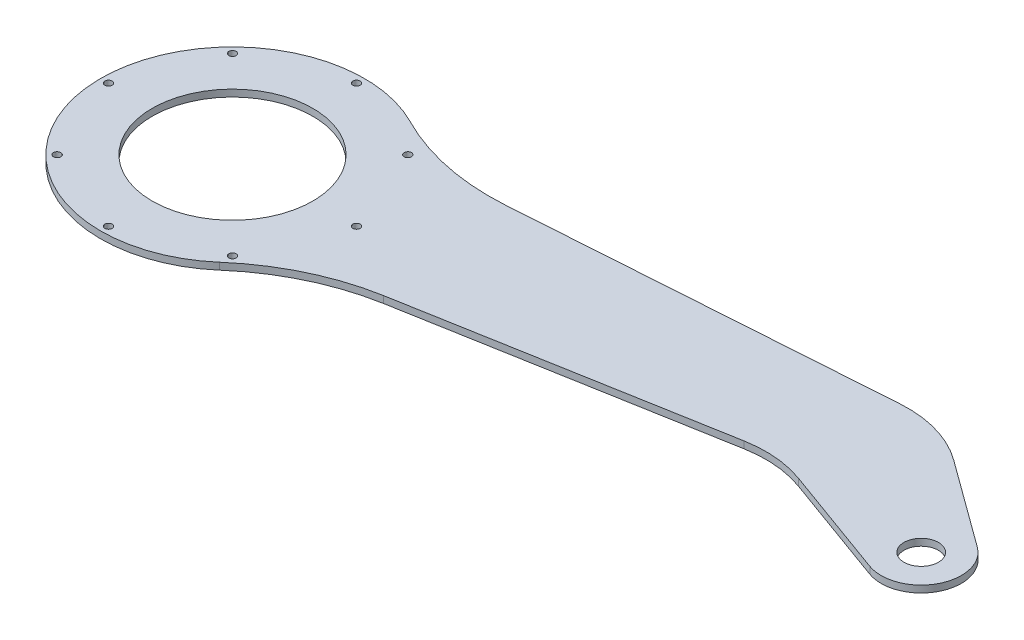
ISO-10303-21;
HEADER;
FILE_DESCRIPTION(('STEP AP214'),'2;1');
FILE_NAME('part.step','',(''),(''),'','','');
FILE_SCHEMA(('AUTOMOTIVE_DESIGN { 1 0 10303 214 1 1 1 1 }'));
ENDSEC;
DATA;
#1=APPLICATION_CONTEXT('core data for automotive mechanical design processes');
#2=APPLICATION_PROTOCOL_DEFINITION('international standard','automotive_design',2000,#1);
#3=PRODUCT_CONTEXT('',#1,'mechanical');
#4=PRODUCT('Part','Part','',(#3));
#5=PRODUCT_RELATED_PRODUCT_CATEGORY('part','',(#4));
#6=PRODUCT_DEFINITION_FORMATION('','',#4);
#7=PRODUCT_DEFINITION_CONTEXT('part definition',#1,'design');
#8=PRODUCT_DEFINITION('design','',#6,#7);
#9=PRODUCT_DEFINITION_SHAPE('','',#8);
#10=(LENGTH_UNIT() NAMED_UNIT(*) SI_UNIT(.MILLI.,.METRE.));
#11=(NAMED_UNIT(*) PLANE_ANGLE_UNIT() SI_UNIT($,.RADIAN.));
#12=(NAMED_UNIT(*) SI_UNIT($,.STERADIAN.) SOLID_ANGLE_UNIT());
#13=UNCERTAINTY_MEASURE_WITH_UNIT(LENGTH_MEASURE(1.E-05),#10,'distance_accuracy_value','');
#14=(GEOMETRIC_REPRESENTATION_CONTEXT(3) GLOBAL_UNCERTAINTY_ASSIGNED_CONTEXT((#13)) GLOBAL_UNIT_ASSIGNED_CONTEXT((#10,
#11,#12)) REPRESENTATION_CONTEXT('',''));
#15=CARTESIAN_POINT('',(0.,0.,0.));
#16=DIRECTION('',(0.,0.,1.));
#17=DIRECTION('',(1.,0.,0.));
#18=AXIS2_PLACEMENT_3D('',#15,#16,#17);
#19=CARTESIAN_POINT('',(28.8662620660002,3.,-79.6494584805988));
#20=DIRECTION('',(-0.340729771025605,0.,0.940161275067655));
#21=DIRECTION('',(0.940161275067655,0.,0.340729771025605));
#22=AXIS2_PLACEMENT_3D('',#19,#20,#21);
#23=PLANE('',#22);
#24=DIRECTION('',(-0.940161275067655,0.,-0.340729771025605));
#25=VECTOR('',#24,1.);
#26=CARTESIAN_POINT('',(28.8662620660002,3.,-79.6494584805988));
#27=LINE('',#26,#25);
#28=CARTESIAN_POINT('',(294.037229007052,3.,16.4528223136839));
#29=VERTEX_POINT('',#28);
#30=CARTESIAN_POINT('',(245.23023292495,3.,-1.23562863671853));
#31=VERTEX_POINT('',#30);
#32=EDGE_CURVE('E114',#29,#31,#27,.T.);
#33=ORIENTED_EDGE('',*,*,#32,.T.);
#34=DIRECTION('',(0.,-1.,0.));
#35=VECTOR('',#34,1.);
#36=CARTESIAN_POINT('',(245.23023292495,0.,-1.23562863671853));
#37=LINE('',#36,#35);
#38=CARTESIAN_POINT('',(245.23023292495,0.,-1.23562863671853));
#39=VERTEX_POINT('',#38);
#40=EDGE_CURVE('E232',#31,#39,#37,.T.);
#41=ORIENTED_EDGE('',*,*,#40,.T.);
#42=DIRECTION('',(-0.940161275067655,0.,-0.340729771025605));
#43=VECTOR('',#42,1.);
#44=CARTESIAN_POINT('',(28.8662620660002,0.,-79.6494584805988));
#45=LINE('',#44,#43);
#46=CARTESIAN_POINT('',(294.037229007052,0.,16.4528223136839));
#47=VERTEX_POINT('',#46);
#48=EDGE_CURVE('E117',#47,#39,#45,.T.);
#49=ORIENTED_EDGE('',*,*,#48,.F.);
#50=DIRECTION('',(0.,-1.,0.));
#51=VECTOR('',#50,1.);
#52=CARTESIAN_POINT('',(294.037229007052,3.,16.4528223136839));
#53=LINE('',#52,#51);
#54=EDGE_CURVE('E110',#29,#47,#53,.T.);
#55=ORIENTED_EDGE('',*,*,#54,.F.);
#56=EDGE_LOOP('',(#33,#41,#49,#55));
#57=FACE_BOUND('',#56,.T.);
#58=ADVANCED_FACE('F35',(#57),#23,.T.);
#59=CARTESIAN_POINT('',(300.,3.,0.));
#60=DIRECTION('',(0.,-1.,0.));
#61=DIRECTION('',(0.,0.,-1.));
#62=AXIS2_PLACEMENT_3D('',#59,#60,#61);
#63=CYLINDRICAL_SURFACE('',#62,17.5);
#64=CARTESIAN_POINT('',(300.,0.,0.));
#65=DIRECTION('',(0.,1.,0.));
#66=DIRECTION('',(0.,0.,1.));
#67=AXIS2_PLACEMENT_3D('',#64,#65,#66);
#68=CIRCLE('',#67,17.5);
#69=CARTESIAN_POINT('',(310.311776158135,0.,-14.1392104611441));
#70=VERTEX_POINT('',#69);
#71=EDGE_CURVE('E183',#47,#70,#68,.T.);
#72=ORIENTED_EDGE('',*,*,#71,.T.);
#73=DIRECTION('',(0.,-1.,0.));
#74=VECTOR('',#73,1.);
#75=CARTESIAN_POINT('',(310.311776158135,3.,-14.1392104611441));
#76=LINE('',#75,#74);
#77=CARTESIAN_POINT('',(310.311776158135,3.,-14.1392104611441));
#78=VERTEX_POINT('',#77);
#79=EDGE_CURVE('E121',#78,#70,#76,.T.);
#80=ORIENTED_EDGE('',*,*,#79,.F.);
#81=CARTESIAN_POINT('',(300.,3.,0.));
#82=DIRECTION('',(0.,1.,0.));
#83=DIRECTION('',(0.,0.,1.));
#84=AXIS2_PLACEMENT_3D('',#81,#82,#83);
#85=CIRCLE('',#84,17.5);
#86=EDGE_CURVE('E124',#29,#78,#85,.T.);
#87=ORIENTED_EDGE('',*,*,#86,.F.);
#88=ORIENTED_EDGE('',*,*,#54,.T.);
#89=EDGE_LOOP('',(#72,#80,#87,#88));
#90=FACE_BOUND('',#89,.T.);
#91=ADVANCED_FACE('F125',(#90),#63,.T.);
#92=CARTESIAN_POINT('',(114.474448029618,3.,-156.964065966195));
#93=DIRECTION('',(-0.589244351893404,0.,0.80795488349395));
#94=DIRECTION('',(0.80795488349395,0.,0.589244351893404));
#95=AXIS2_PLACEMENT_3D('',#92,#93,#94);
#96=PLANE('',#95);
#97=DIRECTION('',(-0.80795488349395,0.,-0.589244351893404));
#98=VECTOR('',#97,1.);
#99=CARTESIAN_POINT('',(114.474448029618,0.,-156.964065966195));
#100=LINE('',#99,#98);
#101=CARTESIAN_POINT('',(272.247100749326,0.,-41.8999127596458));
#102=VERTEX_POINT('',#101);
#103=EDGE_CURVE('E185',#70,#102,#100,.T.);
#104=ORIENTED_EDGE('',*,*,#103,.T.);
#105=DIRECTION('',(0.,-1.,0.));
#106=VECTOR('',#105,1.);
#107=CARTESIAN_POINT('',(272.247100749326,3.,-41.8999127596458));
#108=LINE('',#107,#106);
#109=CARTESIAN_POINT('',(272.247100749326,3.,-41.8999127596458));
#110=VERTEX_POINT('',#109);
#111=EDGE_CURVE('E227',#102,#110,#108,.F.);
#112=ORIENTED_EDGE('',*,*,#111,.T.);
#113=DIRECTION('',(-0.80795488349395,0.,-0.589244351893404));
#114=VECTOR('',#113,1.);
#115=CARTESIAN_POINT('',(114.474448029618,3.,-156.964065966195));
#116=LINE('',#115,#114);
#117=EDGE_CURVE('E130',#78,#110,#116,.T.);
#118=ORIENTED_EDGE('',*,*,#117,.F.);
#119=ORIENTED_EDGE('',*,*,#79,.T.);
#120=EDGE_LOOP('',(#104,#112,#118,#119));
#121=FACE_BOUND('',#120,.T.);
#122=ADVANCED_FACE('F277',(#121),#96,.F.);
#123=CARTESIAN_POINT('',(-2.37846094109579,3.,-34.9190911043183));
#124=DIRECTION('',(-0.0679560268884512,0.,-0.997688317266237));
#125=DIRECTION('',(-0.997688317266237,0.,0.0679560268884512));
#126=AXIS2_PLACEMENT_3D('',#123,#124,#125);
#127=PLANE('',#126);
#128=DIRECTION('',(0.997688317266237,0.,-0.0679560268884512));
#129=VECTOR('',#128,1.);
#130=CARTESIAN_POINT('',(-2.37846094109579,0.,-34.9190911043183));
#131=LINE('',#130,#129);
#132=CARTESIAN_POINT('',(78.5589077176873,0.,-40.4320172413385));
#133=VERTEX_POINT('',#132);
#134=CARTESIAN_POINT('',(239.387081810233,0.,-51.3865844482602));
#135=VERTEX_POINT('',#134);
#136=EDGE_CURVE('E188',#133,#135,#131,.T.);
#137=ORIENTED_EDGE('',*,*,#136,.F.);
#138=DIRECTION('',(0.,-1.,0.));
#139=VECTOR('',#138,1.);
#140=CARTESIAN_POINT('',(78.5589077176873,3.,-40.4320172413385));
#141=LINE('',#140,#139);
#142=CARTESIAN_POINT('',(78.5589077176873,3.,-40.4320172413385));
#143=VERTEX_POINT('',#142);
#144=EDGE_CURVE('E56',#133,#143,#141,.F.);
#145=ORIENTED_EDGE('',*,*,#144,.T.);
#146=DIRECTION('',(0.997688317266237,0.,-0.0679560268884512));
#147=VECTOR('',#146,1.);
#148=CARTESIAN_POINT('',(-2.37846094109579,3.,-34.9190911043183));
#149=LINE('',#148,#147);
#150=CARTESIAN_POINT('',(239.387081810233,3.,-51.3865844482602));
#151=VERTEX_POINT('',#150);
#152=EDGE_CURVE('E144',#143,#151,#149,.T.);
#153=ORIENTED_EDGE('',*,*,#152,.T.);
#154=DIRECTION('',(0.,-1.,0.));
#155=VECTOR('',#154,1.);
#156=CARTESIAN_POINT('',(239.387081810233,0.,-51.3865844482602));
#157=LINE('',#156,#155);
#158=EDGE_CURVE('E120',#151,#135,#157,.T.);
#159=ORIENTED_EDGE('',*,*,#158,.T.);
#160=EDGE_LOOP('',(#137,#145,#153,#159));
#161=FACE_BOUND('',#160,.T.);
#162=ADVANCED_FACE('F270',(#161),#127,.T.);
#163=CARTESIAN_POINT('',(0.,3.,0.));
#164=DIRECTION('',(0.,-1.,0.));
#165=DIRECTION('',(0.,0.,-1.));
#166=AXIS2_PLACEMENT_3D('',#163,#164,#165);
#167=CYLINDRICAL_SURFACE('',#166,57.5);
#168=CARTESIAN_POINT('',(0.,0.,0.));
#169=DIRECTION('',(0.,1.,0.));
#170=DIRECTION('',(0.,0.,1.));
#171=AXIS2_PLACEMENT_3D('',#168,#169,#170);
#172=CIRCLE('',#171,57.5);
#173=CARTESIAN_POINT('',(26.1993018359265,0.,-51.1844369248116));
#174=VERTEX_POINT('',#173);
#175=CARTESIAN_POINT('',(37.7849911882178,0.,43.3421785436116));
#176=VERTEX_POINT('',#175);
#177=EDGE_CURVE('E190',#174,#176,#172,.T.);
#178=ORIENTED_EDGE('',*,*,#177,.T.);
#179=DIRECTION('',(0.,-1.,0.));
#180=VECTOR('',#179,1.);
#181=CARTESIAN_POINT('',(37.7849911882178,3.,43.3421785436116));
#182=LINE('',#181,#180);
#183=CARTESIAN_POINT('',(37.7849911882178,3.,43.3421785436116));
#184=VERTEX_POINT('',#183);
#185=EDGE_CURVE('E245',#176,#184,#182,.F.);
#186=ORIENTED_EDGE('',*,*,#185,.T.);
#187=CARTESIAN_POINT('',(0.,3.,0.));
#188=DIRECTION('',(0.,1.,0.));
#189=DIRECTION('',(0.,0.,1.));
#190=AXIS2_PLACEMENT_3D('',#187,#188,#189);
#191=CIRCLE('',#190,57.5);
#192=CARTESIAN_POINT('',(26.1993018359265,3.,-51.1844369248116));
#193=VERTEX_POINT('',#192);
#194=EDGE_CURVE('E146',#193,#184,#191,.T.);
#195=ORIENTED_EDGE('',*,*,#194,.F.);
#196=DIRECTION('',(0.,-1.,0.));
#197=VECTOR('',#196,1.);
#198=CARTESIAN_POINT('',(26.1993018359265,3.,-51.1844369248116));
#199=LINE('',#198,#197);
#200=EDGE_CURVE('E242',#193,#174,#199,.T.);
#201=ORIENTED_EDGE('',*,*,#200,.T.);
#202=EDGE_LOOP('',(#178,#186,#195,#201));
#203=FACE_BOUND('',#202,.T.);
#204=ADVANCED_FACE('F264',(#203),#167,.T.);
#205=CARTESIAN_POINT('',(54.,3.,1.88539992297529E-13));
#206=DIRECTION('',(0.,-1.,0.));
#207=DIRECTION('',(0.,0.,-1.));
#208=AXIS2_PLACEMENT_3D('',#205,#206,#207);
#209=CYLINDRICAL_SURFACE('',#208,1.6);
#210=CARTESIAN_POINT('',(54.,3.,1.88539992297529E-13));
#211=DIRECTION('',(0.,1.,0.));
#212=DIRECTION('',(0.,0.,1.));
#213=AXIS2_PLACEMENT_3D('',#210,#211,#212);
#214=CIRCLE('',#213,1.6);
#215=CARTESIAN_POINT('',(54.,3.,1.60000000000019));
#216=VERTEX_POINT('',#215);
#217=EDGE_CURVE('E176',#216,#216,#214,.T.);
#218=ORIENTED_EDGE('',*,*,#217,.T.);
#219=EDGE_LOOP('',(#218));
#220=FACE_BOUND('',#219,.T.);
#221=CARTESIAN_POINT('',(54.,0.,1.88539992297529E-13));
#222=DIRECTION('',(0.,1.,0.));
#223=DIRECTION('',(0.,0.,1.));
#224=AXIS2_PLACEMENT_3D('',#221,#222,#223);
#225=CIRCLE('',#224,1.6);
#226=CARTESIAN_POINT('',(54.,0.,1.60000000000019));
#227=VERTEX_POINT('',#226);
#228=EDGE_CURVE('E140',#227,#227,#225,.T.);
#229=ORIENTED_EDGE('',*,*,#228,.F.);
#230=EDGE_LOOP('',(#229));
#231=FACE_BOUND('',#230,.T.);
#232=ADVANCED_FACE('F350',(#220,#231),#209,.F.);
#233=CARTESIAN_POINT('',(0.,3.,-54.));
#234=DIRECTION('',(0.,-1.,0.));
#235=DIRECTION('',(0.,0.,-1.));
#236=AXIS2_PLACEMENT_3D('',#233,#234,#235);
#237=CYLINDRICAL_SURFACE('',#236,1.6);
#238=CARTESIAN_POINT('',(0.,3.,-54.));
#239=DIRECTION('',(0.,1.,0.));
#240=DIRECTION('',(0.,0.,1.));
#241=AXIS2_PLACEMENT_3D('',#238,#239,#240);
#242=CIRCLE('',#241,1.6);
#243=CARTESIAN_POINT('',(0.,3.,-52.4));
#244=VERTEX_POINT('',#243);
#245=EDGE_CURVE('E173',#244,#244,#242,.T.);
#246=ORIENTED_EDGE('',*,*,#245,.T.);
#247=EDGE_LOOP('',(#246));
#248=FACE_BOUND('',#247,.T.);
#249=CARTESIAN_POINT('',(0.,0.,-54.));
#250=DIRECTION('',(0.,1.,0.));
#251=DIRECTION('',(0.,0.,1.));
#252=AXIS2_PLACEMENT_3D('',#249,#250,#251);
#253=CIRCLE('',#252,1.6);
#254=CARTESIAN_POINT('',(0.,0.,-52.4));
#255=VERTEX_POINT('',#254);
#256=EDGE_CURVE('E217',#255,#255,#253,.T.);
#257=ORIENTED_EDGE('',*,*,#256,.F.);
#258=EDGE_LOOP('',(#257));
#259=FACE_BOUND('',#258,.T.);
#260=ADVANCED_FACE('F452',(#248,#259),#237,.F.);
#261=CARTESIAN_POINT('',(38.1837661840736,3.,-38.1837661840735));
#262=DIRECTION('',(0.,-1.,0.));
#263=DIRECTION('',(0.,0.,-1.));
#264=AXIS2_PLACEMENT_3D('',#261,#262,#263);
#265=CYLINDRICAL_SURFACE('',#264,1.6);
#266=CARTESIAN_POINT('',(38.1837661840736,3.,-38.1837661840735));
#267=DIRECTION('',(0.,1.,0.));
#268=DIRECTION('',(0.,0.,1.));
#269=AXIS2_PLACEMENT_3D('',#266,#267,#268);
#270=CIRCLE('',#269,1.6);
#271=CARTESIAN_POINT('',(38.1837661840736,3.,-36.5837661840735));
#272=VERTEX_POINT('',#271);
#273=EDGE_CURVE('E170',#272,#272,#270,.T.);
#274=ORIENTED_EDGE('',*,*,#273,.T.);
#275=EDGE_LOOP('',(#274));
#276=FACE_BOUND('',#275,.T.);
#277=CARTESIAN_POINT('',(38.1837661840736,0.,-38.1837661840735));
#278=DIRECTION('',(0.,1.,0.));
#279=DIRECTION('',(0.,0.,1.));
#280=AXIS2_PLACEMENT_3D('',#277,#278,#279);
#281=CIRCLE('',#280,1.6);
#282=CARTESIAN_POINT('',(38.1837661840736,0.,-36.5837661840735));
#283=VERTEX_POINT('',#282);
#284=EDGE_CURVE('E214',#283,#283,#281,.T.);
#285=ORIENTED_EDGE('',*,*,#284,.F.);
#286=EDGE_LOOP('',(#285));
#287=FACE_BOUND('',#286,.T.);
#288=ADVANCED_FACE('F442',(#276,#287),#265,.F.);
#289=CARTESIAN_POINT('',(38.1837661840734,3.,38.1837661840738));
#290=DIRECTION('',(0.,-1.,0.));
#291=DIRECTION('',(0.,0.,-1.));
#292=AXIS2_PLACEMENT_3D('',#289,#290,#291);
#293=CYLINDRICAL_SURFACE('',#292,1.6);
#294=CARTESIAN_POINT('',(38.1837661840734,3.,38.1837661840738));
#295=DIRECTION('',(0.,1.,0.));
#296=DIRECTION('',(0.,0.,1.));
#297=AXIS2_PLACEMENT_3D('',#294,#295,#296);
#298=CIRCLE('',#297,1.6);
#299=CARTESIAN_POINT('',(38.1837661840734,3.,39.7837661840738));
#300=VERTEX_POINT('',#299);
#301=EDGE_CURVE('E167',#300,#300,#298,.T.);
#302=ORIENTED_EDGE('',*,*,#301,.T.);
#303=EDGE_LOOP('',(#302));
#304=FACE_BOUND('',#303,.T.);
#305=CARTESIAN_POINT('',(38.1837661840734,0.,38.1837661840738));
#306=DIRECTION('',(0.,1.,0.));
#307=DIRECTION('',(0.,0.,1.));
#308=AXIS2_PLACEMENT_3D('',#305,#306,#307);
#309=CIRCLE('',#308,1.6);
#310=CARTESIAN_POINT('',(38.1837661840734,0.,39.7837661840738));
#311=VERTEX_POINT('',#310);
#312=EDGE_CURVE('E211',#311,#311,#309,.T.);
#313=ORIENTED_EDGE('',*,*,#312,.F.);
#314=EDGE_LOOP('',(#313));
#315=FACE_BOUND('',#314,.T.);
#316=ADVANCED_FACE('F432',(#304,#315),#293,.F.);
#317=CARTESIAN_POINT('',(-3.77079984595058E-13,3.,54.));
#318=DIRECTION('',(0.,-1.,0.));
#319=DIRECTION('',(0.,0.,-1.));
#320=AXIS2_PLACEMENT_3D('',#317,#318,#319);
#321=CYLINDRICAL_SURFACE('',#320,1.6);
#322=CARTESIAN_POINT('',(-3.77079984595058E-13,3.,54.));
#323=DIRECTION('',(0.,1.,0.));
#324=DIRECTION('',(0.,0.,1.));
#325=AXIS2_PLACEMENT_3D('',#322,#323,#324);
#326=CIRCLE('',#325,1.6);
#327=CARTESIAN_POINT('',(-3.77079984595058E-13,3.,55.6));
#328=VERTEX_POINT('',#327);
#329=EDGE_CURVE('E164',#328,#328,#326,.T.);
#330=ORIENTED_EDGE('',*,*,#329,.T.);
#331=EDGE_LOOP('',(#330));
#332=FACE_BOUND('',#331,.T.);
#333=CARTESIAN_POINT('',(-3.77079984595058E-13,0.,54.));
#334=DIRECTION('',(0.,1.,0.));
#335=DIRECTION('',(0.,0.,1.));
#336=AXIS2_PLACEMENT_3D('',#333,#334,#335);
#337=CIRCLE('',#336,1.6);
#338=CARTESIAN_POINT('',(-3.77079984595058E-13,0.,55.6));
#339=VERTEX_POINT('',#338);
#340=EDGE_CURVE('E208',#339,#339,#337,.T.);
#341=ORIENTED_EDGE('',*,*,#340,.F.);
#342=EDGE_LOOP('',(#341));
#343=FACE_BOUND('',#342,.T.);
#344=ADVANCED_FACE('F422',(#332,#343),#321,.F.);
#345=CARTESIAN_POINT('',(-38.1837661840739,3.,38.1837661840732));
#346=DIRECTION('',(0.,-1.,0.));
#347=DIRECTION('',(0.,0.,-1.));
#348=AXIS2_PLACEMENT_3D('',#345,#346,#347);
#349=CYLINDRICAL_SURFACE('',#348,1.6);
#350=CARTESIAN_POINT('',(-38.1837661840739,3.,38.1837661840732));
#351=DIRECTION('',(0.,1.,0.));
#352=DIRECTION('',(0.,0.,1.));
#353=AXIS2_PLACEMENT_3D('',#350,#351,#352);
#354=CIRCLE('',#353,1.6);
#355=CARTESIAN_POINT('',(-38.1837661840739,3.,39.7837661840732));
#356=VERTEX_POINT('',#355);
#357=EDGE_CURVE('E161',#356,#356,#354,.T.);
#358=ORIENTED_EDGE('',*,*,#357,.T.);
#359=EDGE_LOOP('',(#358));
#360=FACE_BOUND('',#359,.T.);
#361=CARTESIAN_POINT('',(-38.1837661840739,0.,38.1837661840732));
#362=DIRECTION('',(0.,1.,0.));
#363=DIRECTION('',(0.,0.,1.));
#364=AXIS2_PLACEMENT_3D('',#361,#362,#363);
#365=CIRCLE('',#364,1.6);
#366=CARTESIAN_POINT('',(-38.1837661840739,0.,39.7837661840732));
#367=VERTEX_POINT('',#366);
#368=EDGE_CURVE('E205',#367,#367,#365,.T.);
#369=ORIENTED_EDGE('',*,*,#368,.F.);
#370=EDGE_LOOP('',(#369));
#371=FACE_BOUND('',#370,.T.);
#372=ADVANCED_FACE('F412',(#360,#371),#349,.F.);
#373=CARTESIAN_POINT('',(-54.,3.,-5.65619976892588E-13));
#374=DIRECTION('',(0.,-1.,0.));
#375=DIRECTION('',(0.,0.,-1.));
#376=AXIS2_PLACEMENT_3D('',#373,#374,#375);
#377=CYLINDRICAL_SURFACE('',#376,1.6);
#378=CARTESIAN_POINT('',(-54.,3.,-5.65619976892588E-13));
#379=DIRECTION('',(0.,1.,0.));
#380=DIRECTION('',(0.,0.,1.));
#381=AXIS2_PLACEMENT_3D('',#378,#379,#380);
#382=CIRCLE('',#381,1.6);
#383=CARTESIAN_POINT('',(-54.,3.,1.59999999999943));
#384=VERTEX_POINT('',#383);
#385=EDGE_CURVE('E158',#384,#384,#382,.T.);
#386=ORIENTED_EDGE('',*,*,#385,.T.);
#387=EDGE_LOOP('',(#386));
#388=FACE_BOUND('',#387,.T.);
#389=CARTESIAN_POINT('',(-54.,0.,-5.65619976892588E-13));
#390=DIRECTION('',(0.,1.,0.));
#391=DIRECTION('',(0.,0.,1.));
#392=AXIS2_PLACEMENT_3D('',#389,#390,#391);
#393=CIRCLE('',#392,1.6);
#394=CARTESIAN_POINT('',(-54.,0.,1.59999999999943));
#395=VERTEX_POINT('',#394);
#396=EDGE_CURVE('E202',#395,#395,#393,.T.);
#397=ORIENTED_EDGE('',*,*,#396,.F.);
#398=EDGE_LOOP('',(#397));
#399=FACE_BOUND('',#398,.T.);
#400=ADVANCED_FACE('F402',(#388,#399),#377,.F.);
#401=CARTESIAN_POINT('',(-38.1837661840731,3.,-38.183766184074));
#402=DIRECTION('',(0.,-1.,0.));
#403=DIRECTION('',(0.,0.,-1.));
#404=AXIS2_PLACEMENT_3D('',#401,#402,#403);
#405=CYLINDRICAL_SURFACE('',#404,1.6);
#406=CARTESIAN_POINT('',(-38.1837661840731,3.,-38.183766184074));
#407=DIRECTION('',(0.,1.,0.));
#408=DIRECTION('',(0.,0.,1.));
#409=AXIS2_PLACEMENT_3D('',#406,#407,#408);
#410=CIRCLE('',#409,1.6);
#411=CARTESIAN_POINT('',(-38.1837661840731,3.,-36.583766184074));
#412=VERTEX_POINT('',#411);
#413=EDGE_CURVE('E155',#412,#412,#410,.T.);
#414=ORIENTED_EDGE('',*,*,#413,.T.);
#415=EDGE_LOOP('',(#414));
#416=FACE_BOUND('',#415,.T.);
#417=CARTESIAN_POINT('',(-38.1837661840731,0.,-38.183766184074));
#418=DIRECTION('',(0.,1.,0.));
#419=DIRECTION('',(0.,0.,1.));
#420=AXIS2_PLACEMENT_3D('',#417,#418,#419);
#421=CIRCLE('',#420,1.6);
#422=CARTESIAN_POINT('',(-38.1837661840731,0.,-36.583766184074));
#423=VERTEX_POINT('',#422);
#424=EDGE_CURVE('E199',#423,#423,#421,.T.);
#425=ORIENTED_EDGE('',*,*,#424,.F.);
#426=EDGE_LOOP('',(#425));
#427=FACE_BOUND('',#426,.T.);
#428=ADVANCED_FACE('F392',(#416,#427),#405,.F.);
#429=CARTESIAN_POINT('',(0.,3.,0.));
#430=DIRECTION('',(0.,-1.,0.));
#431=DIRECTION('',(0.,0.,-1.));
#432=AXIS2_PLACEMENT_3D('',#429,#430,#431);
#433=CYLINDRICAL_SURFACE('',#432,35.);
#434=CARTESIAN_POINT('',(0.,3.,0.));
#435=DIRECTION('',(0.,1.,0.));
#436=DIRECTION('',(0.,0.,1.));
#437=AXIS2_PLACEMENT_3D('',#434,#435,#436);
#438=CIRCLE('',#437,35.);
#439=CARTESIAN_POINT('',(0.,3.,35.));
#440=VERTEX_POINT('',#439);
#441=EDGE_CURVE('E152',#440,#440,#438,.T.);
#442=ORIENTED_EDGE('',*,*,#441,.T.);
#443=EDGE_LOOP('',(#442));
#444=FACE_BOUND('',#443,.T.);
#445=CARTESIAN_POINT('',(0.,0.,0.));
#446=DIRECTION('',(0.,1.,0.));
#447=DIRECTION('',(0.,0.,1.));
#448=AXIS2_PLACEMENT_3D('',#445,#446,#447);
#449=CIRCLE('',#448,35.);
#450=CARTESIAN_POINT('',(0.,0.,35.));
#451=VERTEX_POINT('',#450);
#452=EDGE_CURVE('E196',#451,#451,#449,.T.);
#453=ORIENTED_EDGE('',*,*,#452,.F.);
#454=EDGE_LOOP('',(#453));
#455=FACE_BOUND('',#454,.T.);
#456=ADVANCED_FACE('F338',(#444,#455),#433,.F.);
#457=CARTESIAN_POINT('',(6.125,3.,34.4598951681516));
#458=DIRECTION('',(0.175,0.,0.984568433375761));
#459=DIRECTION('',(0.984568433375761,0.,-0.175));
#460=AXIS2_PLACEMENT_3D('',#457,#458,#459);
#461=PLANE('',#460);
#462=DIRECTION('',(-0.984568433375761,0.,0.175));
#463=VECTOR('',#462,1.);
#464=CARTESIAN_POINT('',(6.125,3.,34.4598951681516));
#465=LINE('',#464,#463);
#466=CARTESIAN_POINT('',(219.44374437367,3.,-3.45598655212382));
#467=VERTEX_POINT('',#466);
#468=CARTESIAN_POINT('',(85.99801934164,3.,20.2630370210122));
#469=VERTEX_POINT('',#468);
#470=EDGE_CURVE('E149',#467,#469,#465,.T.);
#471=ORIENTED_EDGE('',*,*,#470,.T.);
#472=DIRECTION('',(0.,-1.,0.));
#473=VECTOR('',#472,1.);
#474=CARTESIAN_POINT('',(85.99801934164,3.,20.2630370210122));
#475=LINE('',#474,#473);
#476=CARTESIAN_POINT('',(85.99801934164,0.,20.2630370210122));
#477=VERTEX_POINT('',#476);
#478=EDGE_CURVE('E239',#469,#477,#475,.T.);
#479=ORIENTED_EDGE('',*,*,#478,.T.);
#480=DIRECTION('',(-0.984568433375761,0.,0.175));
#481=VECTOR('',#480,1.);
#482=CARTESIAN_POINT('',(6.125,0.,34.4598951681516));
#483=LINE('',#482,#481);
#484=CARTESIAN_POINT('',(219.44374437367,0.,-3.45598655212382));
#485=VERTEX_POINT('',#484);
#486=EDGE_CURVE('E193',#485,#477,#483,.T.);
#487=ORIENTED_EDGE('',*,*,#486,.F.);
#488=DIRECTION('',(0.,-1.,0.));
#489=VECTOR('',#488,1.);
#490=CARTESIAN_POINT('',(219.44374437367,3.,-3.45598655212383));
#491=LINE('',#490,#489);
#492=EDGE_CURVE('E234',#485,#467,#491,.F.);
#493=ORIENTED_EDGE('',*,*,#492,.T.);
#494=EDGE_LOOP('',(#471,#479,#487,#493));
#495=FACE_BOUND('',#494,.T.);
#496=ADVANCED_FACE('F257',(#495),#461,.T.);
#497=CARTESIAN_POINT('',(300.,3.,0.));
#498=DIRECTION('',(0.,-1.,0.));
#499=DIRECTION('',(0.,0.,-1.));
#500=AXIS2_PLACEMENT_3D('',#497,#498,#499);
#501=CYLINDRICAL_SURFACE('',#500,7.50000000000001);
#502=CARTESIAN_POINT('',(300.,3.,0.));
#503=DIRECTION('',(0.,1.,0.));
#504=DIRECTION('',(0.,0.,1.));
#505=AXIS2_PLACEMENT_3D('',#502,#503,#504);
#506=CIRCLE('',#505,7.50000000000001);
#507=CARTESIAN_POINT('',(300.,3.,7.50000000000001));
#508=VERTEX_POINT('',#507);
#509=EDGE_CURVE('E179',#508,#508,#506,.T.);
#510=ORIENTED_EDGE('',*,*,#509,.T.);
#511=EDGE_LOOP('',(#510));
#512=FACE_BOUND('',#511,.T.);
#513=CARTESIAN_POINT('',(300.,0.,0.));
#514=DIRECTION('',(0.,1.,0.));
#515=DIRECTION('',(0.,0.,1.));
#516=AXIS2_PLACEMENT_3D('',#513,#514,#515);
#517=CIRCLE('',#516,7.50000000000001);
#518=CARTESIAN_POINT('',(300.,0.,7.50000000000001));
#519=VERTEX_POINT('',#518);
#520=EDGE_CURVE('E137',#519,#519,#517,.T.);
#521=ORIENTED_EDGE('',*,*,#520,.F.);
#522=EDGE_LOOP('',(#521));
#523=FACE_BOUND('',#522,.T.);
#524=ADVANCED_FACE('F326',(#512,#523),#501,.F.);
#525=CARTESIAN_POINT('',(0.,3.,0.));
#526=DIRECTION('',(0.,1.,0.));
#527=DIRECTION('',(0.,0.,1.));
#528=AXIS2_PLACEMENT_3D('',#525,#526,#527);
#529=PLANE('',#528);
#530=ORIENTED_EDGE('',*,*,#117,.T.);
#531=CARTESIAN_POINT('',(242.784883154656,3.,-1.50216858494831));
#532=DIRECTION('',(0.,1.,0.));
#533=DIRECTION('',(0.,0.,1.));
#534=AXIS2_PLACEMENT_3D('',#531,#532,#533);
#535=CIRCLE('',#534,50.);
#536=EDGE_CURVE('E229',#110,#151,#535,.T.);
#537=ORIENTED_EDGE('',*,*,#536,.T.);
#538=ORIENTED_EDGE('',*,*,#152,.F.);
#539=CARTESIAN_POINT('',(71.7633050288422,3.,-140.200848967962));
#540=DIRECTION('',(0.,1.,0.));
#541=DIRECTION('',(0.,0.,1.));
#542=AXIS2_PLACEMENT_3D('',#539,#540,#541);
#543=CIRCLE('',#542,100.);
#544=EDGE_CURVE('E11',#143,#193,#543,.F.);
#545=ORIENTED_EDGE('',*,*,#544,.T.);
#546=ORIENTED_EDGE('',*,*,#194,.T.);
#547=CARTESIAN_POINT('',(103.49801934164,3.,118.719880358588));
#548=DIRECTION('',(0.,1.,0.));
#549=DIRECTION('',(0.,0.,1.));
#550=AXIS2_PLACEMENT_3D('',#547,#548,#549);
#551=CIRCLE('',#550,100.);
#552=EDGE_CURVE('E250',#184,#469,#551,.F.);
#553=ORIENTED_EDGE('',*,*,#552,.T.);
#554=ORIENTED_EDGE('',*,*,#470,.F.);
#555=CARTESIAN_POINT('',(228.19374437367,3.,45.7724351166642));
#556=DIRECTION('',(0.,1.,0.));
#557=DIRECTION('',(0.,0.,1.));
#558=AXIS2_PLACEMENT_3D('',#555,#556,#557);
#559=CIRCLE('',#558,50.);
#560=EDGE_CURVE('E136',#467,#31,#559,.F.);
#561=ORIENTED_EDGE('',*,*,#560,.T.);
#562=ORIENTED_EDGE('',*,*,#32,.F.);
#563=ORIENTED_EDGE('',*,*,#86,.T.);
#564=EDGE_LOOP('',(#530,#537,#538,#545,#546,#553,#554,#561,#562,#563));
#565=FACE_BOUND('',#564,.T.);
#566=ORIENTED_EDGE('',*,*,#441,.F.);
#567=EDGE_LOOP('',(#566));
#568=FACE_BOUND('',#567,.T.);
#569=ORIENTED_EDGE('',*,*,#413,.F.);
#570=EDGE_LOOP('',(#569));
#571=FACE_BOUND('',#570,.T.);
#572=ORIENTED_EDGE('',*,*,#385,.F.);
#573=EDGE_LOOP('',(#572));
#574=FACE_BOUND('',#573,.T.);
#575=ORIENTED_EDGE('',*,*,#357,.F.);
#576=EDGE_LOOP('',(#575));
#577=FACE_BOUND('',#576,.T.);
#578=ORIENTED_EDGE('',*,*,#329,.F.);
#579=EDGE_LOOP('',(#578));
#580=FACE_BOUND('',#579,.T.);
#581=ORIENTED_EDGE('',*,*,#301,.F.);
#582=EDGE_LOOP('',(#581));
#583=FACE_BOUND('',#582,.T.);
#584=ORIENTED_EDGE('',*,*,#273,.F.);
#585=EDGE_LOOP('',(#584));
#586=FACE_BOUND('',#585,.T.);
#587=ORIENTED_EDGE('',*,*,#245,.F.);
#588=EDGE_LOOP('',(#587));
#589=FACE_BOUND('',#588,.T.);
#590=ORIENTED_EDGE('',*,*,#217,.F.);
#591=EDGE_LOOP('',(#590));
#592=FACE_BOUND('',#591,.T.);
#593=ORIENTED_EDGE('',*,*,#509,.F.);
#594=EDGE_LOOP('',(#593));
#595=FACE_BOUND('',#594,.T.);
#596=ADVANCED_FACE('F132',(#565,#568,#571,#574,#577,#580,#583,#586,#589,#592,#595),#529,.T.);
#597=CARTESIAN_POINT('',(0.,0.,0.));
#598=DIRECTION('',(0.,1.,0.));
#599=DIRECTION('',(0.,0.,1.));
#600=AXIS2_PLACEMENT_3D('',#597,#598,#599);
#601=PLANE('',#600);
#602=ORIENTED_EDGE('',*,*,#177,.F.);
#603=CARTESIAN_POINT('',(71.7633050288422,0.,-140.200848967962));
#604=DIRECTION('',(0.,1.,0.));
#605=DIRECTION('',(0.,0.,1.));
#606=AXIS2_PLACEMENT_3D('',#603,#604,#605);
#607=CIRCLE('',#606,100.);
#608=EDGE_CURVE('E43',#174,#133,#607,.T.);
#609=ORIENTED_EDGE('',*,*,#608,.T.);
#610=ORIENTED_EDGE('',*,*,#136,.T.);
#611=CARTESIAN_POINT('',(242.784883154656,0.,-1.50216858494831));
#612=DIRECTION('',(0.,1.,0.));
#613=DIRECTION('',(0.,0.,1.));
#614=AXIS2_PLACEMENT_3D('',#611,#612,#613);
#615=CIRCLE('',#614,50.);
#616=EDGE_CURVE('E225',#135,#102,#615,.F.);
#617=ORIENTED_EDGE('',*,*,#616,.T.);
#618=ORIENTED_EDGE('',*,*,#103,.F.);
#619=ORIENTED_EDGE('',*,*,#71,.F.);
#620=ORIENTED_EDGE('',*,*,#48,.T.);
#621=CARTESIAN_POINT('',(228.19374437367,0.,45.7724351166642));
#622=DIRECTION('',(0.,1.,0.));
#623=DIRECTION('',(0.,0.,1.));
#624=AXIS2_PLACEMENT_3D('',#621,#622,#623);
#625=CIRCLE('',#624,50.);
#626=EDGE_CURVE('E236',#39,#485,#625,.T.);
#627=ORIENTED_EDGE('',*,*,#626,.T.);
#628=ORIENTED_EDGE('',*,*,#486,.T.);
#629=CARTESIAN_POINT('',(103.49801934164,0.,118.719880358588));
#630=DIRECTION('',(0.,1.,0.));
#631=DIRECTION('',(0.,0.,1.));
#632=AXIS2_PLACEMENT_3D('',#629,#630,#631);
#633=CIRCLE('',#632,100.);
#634=EDGE_CURVE('E248',#477,#176,#633,.T.);
#635=ORIENTED_EDGE('',*,*,#634,.T.);
#636=EDGE_LOOP('',(#602,#609,#610,#617,#618,#619,#620,#627,#628,#635));
#637=FACE_BOUND('',#636,.T.);
#638=ORIENTED_EDGE('',*,*,#452,.T.);
#639=EDGE_LOOP('',(#638));
#640=FACE_BOUND('',#639,.T.);
#641=ORIENTED_EDGE('',*,*,#424,.T.);
#642=EDGE_LOOP('',(#641));
#643=FACE_BOUND('',#642,.T.);
#644=ORIENTED_EDGE('',*,*,#396,.T.);
#645=EDGE_LOOP('',(#644));
#646=FACE_BOUND('',#645,.T.);
#647=ORIENTED_EDGE('',*,*,#368,.T.);
#648=EDGE_LOOP('',(#647));
#649=FACE_BOUND('',#648,.T.);
#650=ORIENTED_EDGE('',*,*,#340,.T.);
#651=EDGE_LOOP('',(#650));
#652=FACE_BOUND('',#651,.T.);
#653=ORIENTED_EDGE('',*,*,#312,.T.);
#654=EDGE_LOOP('',(#653));
#655=FACE_BOUND('',#654,.T.);
#656=ORIENTED_EDGE('',*,*,#284,.T.);
#657=EDGE_LOOP('',(#656));
#658=FACE_BOUND('',#657,.T.);
#659=ORIENTED_EDGE('',*,*,#256,.T.);
#660=EDGE_LOOP('',(#659));
#661=FACE_BOUND('',#660,.T.);
#662=ORIENTED_EDGE('',*,*,#228,.T.);
#663=EDGE_LOOP('',(#662));
#664=FACE_BOUND('',#663,.T.);
#665=ORIENTED_EDGE('',*,*,#520,.T.);
#666=EDGE_LOOP('',(#665));
#667=FACE_BOUND('',#666,.T.);
#668=ADVANCED_FACE('F261',(#637,#640,#643,#646,#649,#652,#655,#658,#661,#664,#667),#601,.F.);
#669=CARTESIAN_POINT('',(242.784883154656,3.,-1.50216858494831));
#670=DIRECTION('',(0.,1.,0.));
#671=DIRECTION('',(0.,0.,1.));
#672=AXIS2_PLACEMENT_3D('',#669,#670,#671);
#673=CYLINDRICAL_SURFACE('',#672,50.);
#674=ORIENTED_EDGE('',*,*,#536,.F.);
#675=ORIENTED_EDGE('',*,*,#111,.F.);
#676=ORIENTED_EDGE('',*,*,#616,.F.);
#677=ORIENTED_EDGE('',*,*,#158,.F.);
#678=EDGE_LOOP('',(#674,#675,#676,#677));
#679=FACE_BOUND('',#678,.T.);
#680=ADVANCED_FACE('F273',(#679),#673,.T.);
#681=CARTESIAN_POINT('',(228.19374437367,3.,45.7724351166642));
#682=DIRECTION('',(0.,1.,0.));
#683=DIRECTION('',(0.,0.,1.));
#684=AXIS2_PLACEMENT_3D('',#681,#682,#683);
#685=CYLINDRICAL_SURFACE('',#684,50.);
#686=ORIENTED_EDGE('',*,*,#560,.F.);
#687=ORIENTED_EDGE('',*,*,#492,.F.);
#688=ORIENTED_EDGE('',*,*,#626,.F.);
#689=ORIENTED_EDGE('',*,*,#40,.F.);
#690=EDGE_LOOP('',(#686,#687,#688,#689));
#691=FACE_BOUND('',#690,.T.);
#692=ADVANCED_FACE('F293',(#691),#685,.F.);
#693=CARTESIAN_POINT('',(103.49801934164,3.,118.719880358588));
#694=DIRECTION('',(0.,-1.,0.));
#695=DIRECTION('',(0.,0.,-1.));
#696=AXIS2_PLACEMENT_3D('',#693,#694,#695);
#697=CYLINDRICAL_SURFACE('',#696,100.);
#698=ORIENTED_EDGE('',*,*,#552,.F.);
#699=ORIENTED_EDGE('',*,*,#185,.F.);
#700=ORIENTED_EDGE('',*,*,#634,.F.);
#701=ORIENTED_EDGE('',*,*,#478,.F.);
#702=EDGE_LOOP('',(#698,#699,#700,#701));
#703=FACE_BOUND('',#702,.T.);
#704=ADVANCED_FACE('F260',(#703),#697,.F.);
#705=CARTESIAN_POINT('',(71.7633050288422,3.,-140.200848967962));
#706=DIRECTION('',(0.,-1.,0.));
#707=DIRECTION('',(0.,0.,-1.));
#708=AXIS2_PLACEMENT_3D('',#705,#706,#707);
#709=CYLINDRICAL_SURFACE('',#708,100.);
#710=ORIENTED_EDGE('',*,*,#544,.F.);
#711=ORIENTED_EDGE('',*,*,#144,.F.);
#712=ORIENTED_EDGE('',*,*,#608,.F.);
#713=ORIENTED_EDGE('',*,*,#200,.F.);
#714=EDGE_LOOP('',(#710,#711,#712,#713));
#715=FACE_BOUND('',#714,.T.);
#716=ADVANCED_FACE('F37',(#715),#709,.F.);
#717=CLOSED_SHELL('',(#58,#91,#122,#162,#204,#232,#260,#288,#316,#344,#372,#400,#428,#456,#496,
#524,#596,#668,#680,#692,#704,#716));
#718=MANIFOLD_SOLID_BREP('B2',#717);
#719=ADVANCED_BREP_SHAPE_REPRESENTATION('',(#18,#718),#14);
#720=SHAPE_DEFINITION_REPRESENTATION(#9,#719);
ENDSEC;
END-ISO-10303-21;
